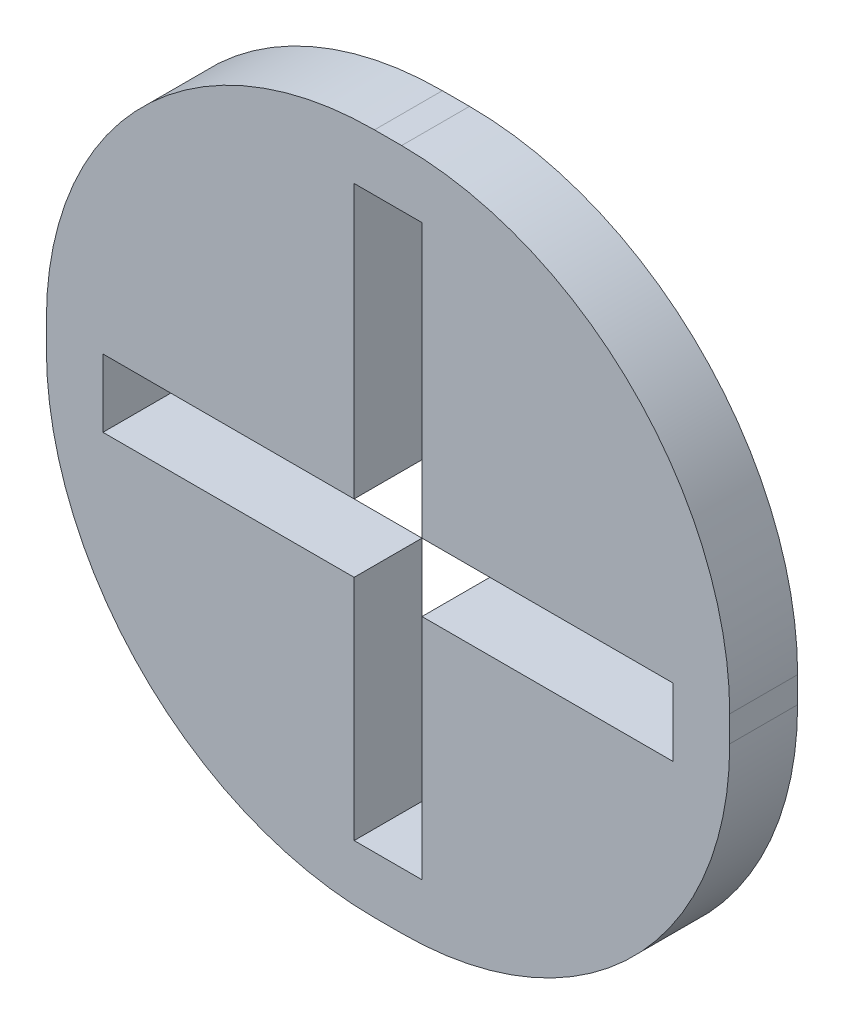
ISO-10303-21;
HEADER;
FILE_DESCRIPTION(('STEP AP214'),'2;1');
FILE_NAME('part.step','',(''),(''),'','','');
FILE_SCHEMA(('AUTOMOTIVE_DESIGN { 1 0 10303 214 1 1 1 1 }'));
ENDSEC;
DATA;
#1=APPLICATION_CONTEXT('core data for automotive mechanical design processes');
#2=APPLICATION_PROTOCOL_DEFINITION('international standard','automotive_design',2000,#1);
#3=PRODUCT_CONTEXT('',#1,'mechanical');
#4=PRODUCT('Part','Part','',(#3));
#5=PRODUCT_RELATED_PRODUCT_CATEGORY('part','',(#4));
#6=PRODUCT_DEFINITION_FORMATION('','',#4);
#7=PRODUCT_DEFINITION_CONTEXT('part definition',#1,'design');
#8=PRODUCT_DEFINITION('design','',#6,#7);
#9=PRODUCT_DEFINITION_SHAPE('','',#8);
#10=(LENGTH_UNIT() NAMED_UNIT(*) SI_UNIT(.MILLI.,.METRE.));
#11=(NAMED_UNIT(*) PLANE_ANGLE_UNIT() SI_UNIT($,.RADIAN.));
#12=(NAMED_UNIT(*) SI_UNIT($,.STERADIAN.) SOLID_ANGLE_UNIT());
#13=UNCERTAINTY_MEASURE_WITH_UNIT(LENGTH_MEASURE(1.E-05),#10,'distance_accuracy_value','');
#14=(GEOMETRIC_REPRESENTATION_CONTEXT(3) GLOBAL_UNCERTAINTY_ASSIGNED_CONTEXT((#13)) GLOBAL_UNIT_ASSIGNED_CONTEXT((#10,
#11,#12)) REPRESENTATION_CONTEXT('',''));
#15=CARTESIAN_POINT('',(0.,0.,0.));
#16=DIRECTION('',(0.,0.,1.));
#17=DIRECTION('',(1.,0.,0.));
#18=AXIS2_PLACEMENT_3D('',#15,#16,#17);
#19=CARTESIAN_POINT('',(0.,15.075,3.));
#20=DIRECTION('',(0.,-1.,0.));
#21=DIRECTION('',(0.,0.,-1.));
#22=AXIS2_PLACEMENT_3D('',#19,#20,#21);
#23=PLANE('',#22);
#24=DIRECTION('',(-1.,0.,0.));
#25=VECTOR('',#24,1.);
#26=CARTESIAN_POINT('',(0.,15.075,0.));
#27=LINE('',#26,#25);
#28=CARTESIAN_POINT('',(0.599999999999993,15.075,0.));
#29=VERTEX_POINT('',#28);
#30=CARTESIAN_POINT('',(-0.600000000000011,15.075,0.));
#31=VERTEX_POINT('',#30);
#32=EDGE_CURVE('E254',#29,#31,#27,.T.);
#33=ORIENTED_EDGE('',*,*,#32,.T.);
#34=DIRECTION('',(0.,0.,-1.));
#35=VECTOR('',#34,1.);
#36=CARTESIAN_POINT('',(-0.600000000000011,15.075,3.));
#37=LINE('',#36,#35);
#38=CARTESIAN_POINT('',(-0.600000000000011,15.075,3.));
#39=VERTEX_POINT('',#38);
#40=EDGE_CURVE('E11',#39,#31,#37,.T.);
#41=ORIENTED_EDGE('',*,*,#40,.F.);
#42=DIRECTION('',(-1.,0.,0.));
#43=VECTOR('',#42,1.);
#44=CARTESIAN_POINT('',(0.,15.075,3.));
#45=LINE('',#44,#43);
#46=CARTESIAN_POINT('',(0.599999999999993,15.075,3.));
#47=VERTEX_POINT('',#46);
#48=EDGE_CURVE('E405',#47,#39,#45,.T.);
#49=ORIENTED_EDGE('',*,*,#48,.F.);
#50=DIRECTION('',(0.,0.,-1.));
#51=VECTOR('',#50,1.);
#52=CARTESIAN_POINT('',(0.599999999999993,15.075,3.));
#53=LINE('',#52,#51);
#54=EDGE_CURVE('E281',#47,#29,#53,.T.);
#55=ORIENTED_EDGE('',*,*,#54,.T.);
#56=EDGE_LOOP('',(#33,#41,#49,#55));
#57=FACE_BOUND('',#56,.T.);
#58=ADVANCED_FACE('F45',(#57),#23,.F.);
#59=CARTESIAN_POINT('',(-0.600000000000009,0.575000000000023,3.));
#60=DIRECTION('',(0.,0.,-1.));
#61=DIRECTION('',(-1.,0.,0.));
#62=AXIS2_PLACEMENT_3D('',#59,#60,#61);
#63=CYLINDRICAL_SURFACE('',#62,14.5);
#64=CARTESIAN_POINT('',(-0.600000000000009,0.575000000000023,0.));
#65=DIRECTION('',(0.,0.,1.));
#66=DIRECTION('',(1.,0.,0.));
#67=AXIS2_PLACEMENT_3D('',#64,#65,#66);
#68=CIRCLE('',#67,14.5);
#69=CARTESIAN_POINT('',(-15.1,0.575000000000014,0.));
#70=VERTEX_POINT('',#69);
#71=EDGE_CURVE('E258',#31,#70,#68,.T.);
#72=ORIENTED_EDGE('',*,*,#71,.T.);
#73=DIRECTION('',(0.,0.,-1.));
#74=VECTOR('',#73,1.);
#75=CARTESIAN_POINT('',(-15.1,0.575000000000014,3.));
#76=LINE('',#75,#74);
#77=CARTESIAN_POINT('',(-15.1,0.575000000000014,3.));
#78=VERTEX_POINT('',#77);
#79=EDGE_CURVE('E56',#78,#70,#76,.T.);
#80=ORIENTED_EDGE('',*,*,#79,.F.);
#81=CARTESIAN_POINT('',(-0.600000000000009,0.575000000000023,3.));
#82=DIRECTION('',(0.,0.,1.));
#83=DIRECTION('',(1.,0.,0.));
#84=AXIS2_PLACEMENT_3D('',#81,#82,#83);
#85=CIRCLE('',#84,14.5);
#86=EDGE_CURVE('E408',#39,#78,#85,.T.);
#87=ORIENTED_EDGE('',*,*,#86,.F.);
#88=ORIENTED_EDGE('',*,*,#40,.T.);
#89=EDGE_LOOP('',(#72,#80,#87,#88));
#90=FACE_BOUND('',#89,.T.);
#91=ADVANCED_FACE('F440',(#90),#63,.T.);
#92=CARTESIAN_POINT('',(-15.1,0.,3.));
#93=DIRECTION('',(-1.,0.,0.));
#94=DIRECTION('',(0.,0.,1.));
#95=AXIS2_PLACEMENT_3D('',#92,#93,#94);
#96=PLANE('',#95);
#97=DIRECTION('',(0.,1.,0.));
#98=VECTOR('',#97,1.);
#99=CARTESIAN_POINT('',(-15.1,0.,0.));
#100=LINE('',#99,#98);
#101=CARTESIAN_POINT('',(-15.1,-0.575000000000006,0.));
#102=VERTEX_POINT('',#101);
#103=EDGE_CURVE('E262',#102,#70,#100,.T.);
#104=ORIENTED_EDGE('',*,*,#103,.F.);
#105=DIRECTION('',(0.,0.,-1.));
#106=VECTOR('',#105,1.);
#107=CARTESIAN_POINT('',(-15.1,-0.575000000000006,3.));
#108=LINE('',#107,#106);
#109=CARTESIAN_POINT('',(-15.1,-0.575000000000006,3.));
#110=VERTEX_POINT('',#109);
#111=EDGE_CURVE('E291',#110,#102,#108,.T.);
#112=ORIENTED_EDGE('',*,*,#111,.F.);
#113=DIRECTION('',(0.,1.,0.));
#114=VECTOR('',#113,1.);
#115=CARTESIAN_POINT('',(-15.1,0.,3.));
#116=LINE('',#115,#114);
#117=EDGE_CURVE('E411',#110,#78,#116,.T.);
#118=ORIENTED_EDGE('',*,*,#117,.T.);
#119=ORIENTED_EDGE('',*,*,#79,.T.);
#120=EDGE_LOOP('',(#104,#112,#118,#119));
#121=FACE_BOUND('',#120,.T.);
#122=ADVANCED_FACE('F445',(#121),#96,.T.);
#123=CARTESIAN_POINT('',(-0.600000000000009,-0.574999999999998,3.));
#124=DIRECTION('',(0.,0.,-1.));
#125=DIRECTION('',(-1.,0.,0.));
#126=AXIS2_PLACEMENT_3D('',#123,#124,#125);
#127=CYLINDRICAL_SURFACE('',#126,14.5);
#128=CARTESIAN_POINT('',(-0.600000000000009,-0.574999999999998,0.));
#129=DIRECTION('',(0.,0.,1.));
#130=DIRECTION('',(1.,0.,0.));
#131=AXIS2_PLACEMENT_3D('',#128,#129,#130);
#132=CIRCLE('',#131,14.5);
#133=CARTESIAN_POINT('',(-0.600000000000007,-15.075,0.));
#134=VERTEX_POINT('',#133);
#135=EDGE_CURVE('E266',#134,#102,#132,.F.);
#136=ORIENTED_EDGE('',*,*,#135,.F.);
#137=DIRECTION('',(0.,0.,-1.));
#138=VECTOR('',#137,1.);
#139=CARTESIAN_POINT('',(-0.600000000000007,-15.075,3.));
#140=LINE('',#139,#138);
#141=CARTESIAN_POINT('',(-0.600000000000007,-15.075,3.));
#142=VERTEX_POINT('',#141);
#143=EDGE_CURVE('E288',#142,#134,#140,.T.);
#144=ORIENTED_EDGE('',*,*,#143,.F.);
#145=CARTESIAN_POINT('',(-0.600000000000009,-0.574999999999998,3.));
#146=DIRECTION('',(0.,0.,1.));
#147=DIRECTION('',(1.,0.,0.));
#148=AXIS2_PLACEMENT_3D('',#145,#146,#147);
#149=CIRCLE('',#148,14.5);
#150=EDGE_CURVE('E415',#142,#110,#149,.F.);
#151=ORIENTED_EDGE('',*,*,#150,.T.);
#152=ORIENTED_EDGE('',*,*,#111,.T.);
#153=EDGE_LOOP('',(#136,#144,#151,#152));
#154=FACE_BOUND('',#153,.T.);
#155=ADVANCED_FACE('F608',(#154),#127,.T.);
#156=CARTESIAN_POINT('',(0.,-15.075,3.));
#157=DIRECTION('',(0.,-1.,0.));
#158=DIRECTION('',(0.,0.,-1.));
#159=AXIS2_PLACEMENT_3D('',#156,#157,#158);
#160=PLANE('',#159);
#161=DIRECTION('',(-1.,0.,0.));
#162=VECTOR('',#161,1.);
#163=CARTESIAN_POINT('',(0.,-15.075,0.));
#164=LINE('',#163,#162);
#165=CARTESIAN_POINT('',(0.600000000000007,-15.075,0.));
#166=VERTEX_POINT('',#165);
#167=EDGE_CURVE('E270',#166,#134,#164,.T.);
#168=ORIENTED_EDGE('',*,*,#167,.F.);
#169=DIRECTION('',(0.,0.,-1.));
#170=VECTOR('',#169,1.);
#171=CARTESIAN_POINT('',(0.600000000000007,-15.075,3.));
#172=LINE('',#171,#170);
#173=CARTESIAN_POINT('',(0.600000000000007,-15.075,3.));
#174=VERTEX_POINT('',#173);
#175=EDGE_CURVE('E212',#174,#166,#172,.T.);
#176=ORIENTED_EDGE('',*,*,#175,.F.);
#177=DIRECTION('',(-1.,0.,0.));
#178=VECTOR('',#177,1.);
#179=CARTESIAN_POINT('',(0.,-15.075,3.));
#180=LINE('',#179,#178);
#181=EDGE_CURVE('E203',#174,#142,#180,.T.);
#182=ORIENTED_EDGE('',*,*,#181,.T.);
#183=ORIENTED_EDGE('',*,*,#143,.T.);
#184=EDGE_LOOP('',(#168,#176,#182,#183));
#185=FACE_BOUND('',#184,.T.);
#186=ADVANCED_FACE('F421',(#185),#160,.T.);
#187=CARTESIAN_POINT('',(0.6,-0.574999999999997,3.));
#188=DIRECTION('',(0.,0.,-1.));
#189=DIRECTION('',(-1.,0.,0.));
#190=AXIS2_PLACEMENT_3D('',#187,#188,#189);
#191=CYLINDRICAL_SURFACE('',#190,14.5);
#192=CARTESIAN_POINT('',(0.6,-0.574999999999997,0.));
#193=DIRECTION('',(0.,0.,1.));
#194=DIRECTION('',(1.,0.,0.));
#195=AXIS2_PLACEMENT_3D('',#192,#193,#194);
#196=CIRCLE('',#195,14.5);
#197=CARTESIAN_POINT('',(15.1,-0.574999999999997,0.));
#198=VERTEX_POINT('',#197);
#199=EDGE_CURVE('E210',#166,#198,#196,.T.);
#200=ORIENTED_EDGE('',*,*,#199,.T.);
#201=DIRECTION('',(0.,0.,-1.));
#202=VECTOR('',#201,1.);
#203=CARTESIAN_POINT('',(15.1,-0.574999999999997,3.));
#204=LINE('',#203,#202);
#205=CARTESIAN_POINT('',(15.1,-0.574999999999997,3.));
#206=VERTEX_POINT('',#205);
#207=EDGE_CURVE('E207',#206,#198,#204,.T.);
#208=ORIENTED_EDGE('',*,*,#207,.F.);
#209=CARTESIAN_POINT('',(0.6,-0.574999999999997,3.));
#210=DIRECTION('',(0.,0.,1.));
#211=DIRECTION('',(1.,0.,0.));
#212=AXIS2_PLACEMENT_3D('',#209,#210,#211);
#213=CIRCLE('',#212,14.5);
#214=EDGE_CURVE('E196',#174,#206,#213,.T.);
#215=ORIENTED_EDGE('',*,*,#214,.F.);
#216=ORIENTED_EDGE('',*,*,#175,.T.);
#217=EDGE_LOOP('',(#200,#208,#215,#216));
#218=FACE_BOUND('',#217,.T.);
#219=ADVANCED_FACE('F208',(#218),#191,.T.);
#220=CARTESIAN_POINT('',(15.1,0.,3.));
#221=DIRECTION('',(-1.,0.,0.));
#222=DIRECTION('',(0.,0.,1.));
#223=AXIS2_PLACEMENT_3D('',#220,#221,#222);
#224=PLANE('',#223);
#225=DIRECTION('',(0.,1.,0.));
#226=VECTOR('',#225,1.);
#227=CARTESIAN_POINT('',(15.1,0.,0.));
#228=LINE('',#227,#226);
#229=CARTESIAN_POINT('',(15.1,0.575000000000023,0.));
#230=VERTEX_POINT('',#229);
#231=EDGE_CURVE('E130',#198,#230,#228,.T.);
#232=ORIENTED_EDGE('',*,*,#231,.T.);
#233=DIRECTION('',(0.,0.,-1.));
#234=VECTOR('',#233,1.);
#235=CARTESIAN_POINT('',(15.1,0.575000000000023,3.));
#236=LINE('',#235,#234);
#237=CARTESIAN_POINT('',(15.1,0.575000000000023,3.));
#238=VERTEX_POINT('',#237);
#239=EDGE_CURVE('E213',#238,#230,#236,.T.);
#240=ORIENTED_EDGE('',*,*,#239,.F.);
#241=DIRECTION('',(0.,1.,0.));
#242=VECTOR('',#241,1.);
#243=CARTESIAN_POINT('',(15.1,0.,3.));
#244=LINE('',#243,#242);
#245=EDGE_CURVE('E200',#206,#238,#244,.T.);
#246=ORIENTED_EDGE('',*,*,#245,.F.);
#247=ORIENTED_EDGE('',*,*,#207,.T.);
#248=EDGE_LOOP('',(#232,#240,#246,#247));
#249=FACE_BOUND('',#248,.T.);
#250=ADVANCED_FACE('F215',(#249),#224,.F.);
#251=CARTESIAN_POINT('',(0.,12.575,3.));
#252=DIRECTION('',(0.,1.,0.));
#253=DIRECTION('',(0.,0.,1.));
#254=AXIS2_PLACEMENT_3D('',#251,#252,#253);
#255=PLANE('',#254);
#256=DIRECTION('',(1.,0.,0.));
#257=VECTOR('',#256,1.);
#258=CARTESIAN_POINT('',(0.,12.575,0.));
#259=LINE('',#258,#257);
#260=CARTESIAN_POINT('',(-1.5,12.575,0.));
#261=VERTEX_POINT('',#260);
#262=CARTESIAN_POINT('',(1.5,12.575,0.));
#263=VERTEX_POINT('',#262);
#264=EDGE_CURVE('E223',#261,#263,#259,.T.);
#265=ORIENTED_EDGE('',*,*,#264,.T.);
#266=DIRECTION('',(0.,0.,-1.));
#267=VECTOR('',#266,1.);
#268=CARTESIAN_POINT('',(1.5,12.575,3.));
#269=LINE('',#268,#267);
#270=CARTESIAN_POINT('',(1.5,12.575,3.));
#271=VERTEX_POINT('',#270);
#272=EDGE_CURVE('E49',#271,#263,#269,.T.);
#273=ORIENTED_EDGE('',*,*,#272,.F.);
#274=DIRECTION('',(1.,0.,0.));
#275=VECTOR('',#274,1.);
#276=CARTESIAN_POINT('',(0.,12.575,3.));
#277=LINE('',#276,#275);
#278=CARTESIAN_POINT('',(-1.5,12.575,3.));
#279=VERTEX_POINT('',#278);
#280=EDGE_CURVE('E280',#279,#271,#277,.T.);
#281=ORIENTED_EDGE('',*,*,#280,.F.);
#282=DIRECTION('',(0.,0.,-1.));
#283=VECTOR('',#282,1.);
#284=CARTESIAN_POINT('',(-1.5,12.575,3.));
#285=LINE('',#284,#283);
#286=EDGE_CURVE('E219',#279,#261,#285,.T.);
#287=ORIENTED_EDGE('',*,*,#286,.T.);
#288=EDGE_LOOP('',(#265,#273,#281,#287));
#289=FACE_BOUND('',#288,.T.);
#290=ADVANCED_FACE('F47',(#289),#255,.F.);
#291=CARTESIAN_POINT('',(1.5,0.,3.));
#292=DIRECTION('',(1.,0.,0.));
#293=DIRECTION('',(0.,0.,-1.));
#294=AXIS2_PLACEMENT_3D('',#291,#292,#293);
#295=PLANE('',#294);
#296=DIRECTION('',(0.,-1.,0.));
#297=VECTOR('',#296,1.);
#298=CARTESIAN_POINT('',(1.5,0.,0.));
#299=LINE('',#298,#297);
#300=CARTESIAN_POINT('',(1.5,0.499999999999999,0.));
#301=VERTEX_POINT('',#300);
#302=EDGE_CURVE('E227',#263,#301,#299,.T.);
#303=ORIENTED_EDGE('',*,*,#302,.T.);
#304=DIRECTION('',(0.,0.,-1.));
#305=VECTOR('',#304,1.);
#306=CARTESIAN_POINT('',(1.5,0.499999999999999,3.));
#307=LINE('',#306,#305);
#308=CARTESIAN_POINT('',(1.5,0.499999999999999,3.));
#309=VERTEX_POINT('',#308);
#310=EDGE_CURVE('E329',#309,#301,#307,.T.);
#311=ORIENTED_EDGE('',*,*,#310,.F.);
#312=DIRECTION('',(0.,-1.,0.));
#313=VECTOR('',#312,1.);
#314=CARTESIAN_POINT('',(1.5,0.,3.));
#315=LINE('',#314,#313);
#316=EDGE_CURVE('E145',#271,#309,#315,.T.);
#317=ORIENTED_EDGE('',*,*,#316,.F.);
#318=ORIENTED_EDGE('',*,*,#272,.T.);
#319=EDGE_LOOP('',(#303,#311,#317,#318));
#320=FACE_BOUND('',#319,.T.);
#321=ADVANCED_FACE('F337',(#320),#295,.F.);
#322=CARTESIAN_POINT('',(0.,0.499999999999999,3.));
#323=DIRECTION('',(0.,1.,0.));
#324=DIRECTION('',(0.,0.,1.));
#325=AXIS2_PLACEMENT_3D('',#322,#323,#324);
#326=PLANE('',#325);
#327=DIRECTION('',(1.,0.,0.));
#328=VECTOR('',#327,1.);
#329=CARTESIAN_POINT('',(0.,0.499999999999999,0.));
#330=LINE('',#329,#328);
#331=CARTESIAN_POINT('',(12.6,0.499999999999999,0.));
#332=VERTEX_POINT('',#331);
#333=EDGE_CURVE('E230',#301,#332,#330,.T.);
#334=ORIENTED_EDGE('',*,*,#333,.T.);
#335=DIRECTION('',(0.,0.,-1.));
#336=VECTOR('',#335,1.);
#337=CARTESIAN_POINT('',(12.6,0.499999999999999,3.));
#338=LINE('',#337,#336);
#339=CARTESIAN_POINT('',(12.6,0.499999999999999,3.));
#340=VERTEX_POINT('',#339);
#341=EDGE_CURVE('E326',#340,#332,#338,.T.);
#342=ORIENTED_EDGE('',*,*,#341,.F.);
#343=DIRECTION('',(1.,0.,0.));
#344=VECTOR('',#343,1.);
#345=CARTESIAN_POINT('',(0.,0.499999999999999,3.));
#346=LINE('',#345,#344);
#347=EDGE_CURVE('E477',#309,#340,#346,.T.);
#348=ORIENTED_EDGE('',*,*,#347,.F.);
#349=ORIENTED_EDGE('',*,*,#310,.T.);
#350=EDGE_LOOP('',(#334,#342,#348,#349));
#351=FACE_BOUND('',#350,.T.);
#352=ADVANCED_FACE('F452',(#351),#326,.F.);
#353=CARTESIAN_POINT('',(12.6,0.,3.));
#354=DIRECTION('',(1.,0.,0.));
#355=DIRECTION('',(0.,0.,-1.));
#356=AXIS2_PLACEMENT_3D('',#353,#354,#355);
#357=PLANE('',#356);
#358=DIRECTION('',(0.,-1.,0.));
#359=VECTOR('',#358,1.);
#360=CARTESIAN_POINT('',(12.6,0.,0.));
#361=LINE('',#360,#359);
#362=CARTESIAN_POINT('',(12.6,-2.5,0.));
#363=VERTEX_POINT('',#362);
#364=EDGE_CURVE('E234',#332,#363,#361,.T.);
#365=ORIENTED_EDGE('',*,*,#364,.T.);
#366=DIRECTION('',(0.,0.,-1.));
#367=VECTOR('',#366,1.);
#368=CARTESIAN_POINT('',(12.6,-2.5,3.));
#369=LINE('',#368,#367);
#370=CARTESIAN_POINT('',(12.6,-2.5,3.));
#371=VERTEX_POINT('',#370);
#372=EDGE_CURVE('E322',#371,#363,#369,.T.);
#373=ORIENTED_EDGE('',*,*,#372,.F.);
#374=DIRECTION('',(0.,-1.,0.));
#375=VECTOR('',#374,1.);
#376=CARTESIAN_POINT('',(12.6,0.,3.));
#377=LINE('',#376,#375);
#378=EDGE_CURVE('E475',#340,#371,#377,.T.);
#379=ORIENTED_EDGE('',*,*,#378,.F.);
#380=ORIENTED_EDGE('',*,*,#341,.T.);
#381=EDGE_LOOP('',(#365,#373,#379,#380));
#382=FACE_BOUND('',#381,.T.);
#383=ADVANCED_FACE('F461',(#382),#357,.F.);
#384=CARTESIAN_POINT('',(0.,-2.5,3.));
#385=DIRECTION('',(0.,-1.,0.));
#386=DIRECTION('',(0.,0.,-1.));
#387=AXIS2_PLACEMENT_3D('',#384,#385,#386);
#388=PLANE('',#387);
#389=DIRECTION('',(-1.,0.,0.));
#390=VECTOR('',#389,1.);
#391=CARTESIAN_POINT('',(0.,-2.5,0.));
#392=LINE('',#391,#390);
#393=CARTESIAN_POINT('',(1.5,-2.5,0.));
#394=VERTEX_POINT('',#393);
#395=EDGE_CURVE('E238',#363,#394,#392,.T.);
#396=ORIENTED_EDGE('',*,*,#395,.T.);
#397=DIRECTION('',(0.,0.,-1.));
#398=VECTOR('',#397,1.);
#399=CARTESIAN_POINT('',(1.5,-2.5,3.));
#400=LINE('',#399,#398);
#401=CARTESIAN_POINT('',(1.5,-2.5,3.));
#402=VERTEX_POINT('',#401);
#403=EDGE_CURVE('E318',#402,#394,#400,.T.);
#404=ORIENTED_EDGE('',*,*,#403,.F.);
#405=DIRECTION('',(-1.,0.,0.));
#406=VECTOR('',#405,1.);
#407=CARTESIAN_POINT('',(0.,-2.5,3.));
#408=LINE('',#407,#406);
#409=EDGE_CURVE('E397',#371,#402,#408,.T.);
#410=ORIENTED_EDGE('',*,*,#409,.F.);
#411=ORIENTED_EDGE('',*,*,#372,.T.);
#412=EDGE_LOOP('',(#396,#404,#410,#411));
#413=FACE_BOUND('',#412,.T.);
#414=ADVANCED_FACE('F457',(#413),#388,.F.);
#415=CARTESIAN_POINT('',(1.5,-12.575,0.));
#416=VERTEX_POINT('',#415);
#417=EDGE_CURVE('E231',#394,#416,#299,.T.);
#418=ORIENTED_EDGE('',*,*,#417,.T.);
#419=DIRECTION('',(0.,0.,-1.));
#420=VECTOR('',#419,1.);
#421=CARTESIAN_POINT('',(1.5,-12.575,3.));
#422=LINE('',#421,#420);
#423=CARTESIAN_POINT('',(1.5,-12.575,3.));
#424=VERTEX_POINT('',#423);
#425=EDGE_CURVE('E315',#424,#416,#422,.T.);
#426=ORIENTED_EDGE('',*,*,#425,.F.);
#427=EDGE_CURVE('E391',#402,#424,#315,.T.);
#428=ORIENTED_EDGE('',*,*,#427,.F.);
#429=ORIENTED_EDGE('',*,*,#403,.T.);
#430=EDGE_LOOP('',(#418,#426,#428,#429));
#431=FACE_BOUND('',#430,.T.);
#432=ADVANCED_FACE('F377',(#431),#295,.F.);
#433=CARTESIAN_POINT('',(0.,-12.575,3.));
#434=DIRECTION('',(0.,1.,0.));
#435=DIRECTION('',(0.,0.,1.));
#436=AXIS2_PLACEMENT_3D('',#433,#434,#435);
#437=PLANE('',#436);
#438=DIRECTION('',(1.,0.,0.));
#439=VECTOR('',#438,1.);
#440=CARTESIAN_POINT('',(0.,-12.575,0.));
#441=LINE('',#440,#439);
#442=CARTESIAN_POINT('',(-1.5,-12.575,0.));
#443=VERTEX_POINT('',#442);
#444=EDGE_CURVE('E242',#443,#416,#441,.T.);
#445=ORIENTED_EDGE('',*,*,#444,.F.);
#446=DIRECTION('',(0.,0.,-1.));
#447=VECTOR('',#446,1.);
#448=CARTESIAN_POINT('',(-1.5,-12.575,3.));
#449=LINE('',#448,#447);
#450=CARTESIAN_POINT('',(-1.5,-12.575,3.));
#451=VERTEX_POINT('',#450);
#452=EDGE_CURVE('E312',#451,#443,#449,.T.);
#453=ORIENTED_EDGE('',*,*,#452,.F.);
#454=DIRECTION('',(1.,0.,0.));
#455=VECTOR('',#454,1.);
#456=CARTESIAN_POINT('',(0.,-12.575,3.));
#457=LINE('',#456,#455);
#458=EDGE_CURVE('E386',#451,#424,#457,.T.);
#459=ORIENTED_EDGE('',*,*,#458,.T.);
#460=ORIENTED_EDGE('',*,*,#425,.T.);
#461=EDGE_LOOP('',(#445,#453,#459,#460));
#462=FACE_BOUND('',#461,.T.);
#463=ADVANCED_FACE('F384',(#462),#437,.T.);
#464=CARTESIAN_POINT('',(-1.5,0.,3.));
#465=DIRECTION('',(1.,0.,0.));
#466=DIRECTION('',(0.,0.,-1.));
#467=AXIS2_PLACEMENT_3D('',#464,#465,#466);
#468=PLANE('',#467);
#469=DIRECTION('',(0.,-1.,0.));
#470=VECTOR('',#469,1.);
#471=CARTESIAN_POINT('',(-1.5,0.,0.));
#472=LINE('',#471,#470);
#473=CARTESIAN_POINT('',(-1.5,-2.5,0.));
#474=VERTEX_POINT('',#473);
#475=EDGE_CURVE('E246',#474,#443,#472,.T.);
#476=ORIENTED_EDGE('',*,*,#475,.F.);
#477=DIRECTION('',(0.,0.,-1.));
#478=VECTOR('',#477,1.);
#479=CARTESIAN_POINT('',(-1.5,-2.5,3.));
#480=LINE('',#479,#478);
#481=CARTESIAN_POINT('',(-1.5,-2.5,3.));
#482=VERTEX_POINT('',#481);
#483=EDGE_CURVE('E309',#482,#474,#480,.T.);
#484=ORIENTED_EDGE('',*,*,#483,.F.);
#485=DIRECTION('',(0.,-1.,0.));
#486=VECTOR('',#485,1.);
#487=CARTESIAN_POINT('',(-1.5,0.,3.));
#488=LINE('',#487,#486);
#489=EDGE_CURVE('E390',#482,#451,#488,.T.);
#490=ORIENTED_EDGE('',*,*,#489,.T.);
#491=ORIENTED_EDGE('',*,*,#452,.T.);
#492=EDGE_LOOP('',(#476,#484,#490,#491));
#493=FACE_BOUND('',#492,.T.);
#494=ADVANCED_FACE('F436',(#493),#468,.T.);
#495=CARTESIAN_POINT('',(-12.6,-2.5,0.));
#496=VERTEX_POINT('',#495);
#497=EDGE_CURVE('E241',#474,#496,#392,.T.);
#498=ORIENTED_EDGE('',*,*,#497,.T.);
#499=DIRECTION('',(0.,0.,-1.));
#500=VECTOR('',#499,1.);
#501=CARTESIAN_POINT('',(-12.6,-2.5,3.));
#502=LINE('',#501,#500);
#503=CARTESIAN_POINT('',(-12.6,-2.5,3.));
#504=VERTEX_POINT('',#503);
#505=EDGE_CURVE('E305',#504,#496,#502,.T.);
#506=ORIENTED_EDGE('',*,*,#505,.F.);
#507=EDGE_CURVE('E369',#482,#504,#408,.T.);
#508=ORIENTED_EDGE('',*,*,#507,.F.);
#509=ORIENTED_EDGE('',*,*,#483,.T.);
#510=EDGE_LOOP('',(#498,#506,#508,#509));
#511=FACE_BOUND('',#510,.T.);
#512=ADVANCED_FACE('F368',(#511),#388,.F.);
#513=CARTESIAN_POINT('',(-12.6,0.,3.));
#514=DIRECTION('',(-1.,0.,0.));
#515=DIRECTION('',(0.,0.,1.));
#516=AXIS2_PLACEMENT_3D('',#513,#514,#515);
#517=PLANE('',#516);
#518=DIRECTION('',(0.,1.,0.));
#519=VECTOR('',#518,1.);
#520=CARTESIAN_POINT('',(-12.6,0.,0.));
#521=LINE('',#520,#519);
#522=CARTESIAN_POINT('',(-12.6,0.499999999999999,0.));
#523=VERTEX_POINT('',#522);
#524=EDGE_CURVE('E251',#496,#523,#521,.T.);
#525=ORIENTED_EDGE('',*,*,#524,.T.);
#526=DIRECTION('',(0.,0.,-1.));
#527=VECTOR('',#526,1.);
#528=CARTESIAN_POINT('',(-12.6,0.499999999999999,3.));
#529=LINE('',#528,#527);
#530=CARTESIAN_POINT('',(-12.6,0.499999999999999,3.));
#531=VERTEX_POINT('',#530);
#532=EDGE_CURVE('E301',#531,#523,#529,.T.);
#533=ORIENTED_EDGE('',*,*,#532,.F.);
#534=DIRECTION('',(0.,1.,0.));
#535=VECTOR('',#534,1.);
#536=CARTESIAN_POINT('',(-12.6,0.,3.));
#537=LINE('',#536,#535);
#538=EDGE_CURVE('E365',#504,#531,#537,.T.);
#539=ORIENTED_EDGE('',*,*,#538,.F.);
#540=ORIENTED_EDGE('',*,*,#505,.T.);
#541=EDGE_LOOP('',(#525,#533,#539,#540));
#542=FACE_BOUND('',#541,.T.);
#543=ADVANCED_FACE('F362',(#542),#517,.F.);
#544=CARTESIAN_POINT('',(-1.5,0.499999999999999,0.));
#545=VERTEX_POINT('',#544);
#546=EDGE_CURVE('E235',#523,#545,#330,.T.);
#547=ORIENTED_EDGE('',*,*,#546,.T.);
#548=DIRECTION('',(0.,0.,-1.));
#549=VECTOR('',#548,1.);
#550=CARTESIAN_POINT('',(-1.5,0.499999999999999,3.));
#551=LINE('',#550,#549);
#552=CARTESIAN_POINT('',(-1.5,0.499999999999999,3.));
#553=VERTEX_POINT('',#552);
#554=EDGE_CURVE('E298',#553,#545,#551,.T.);
#555=ORIENTED_EDGE('',*,*,#554,.F.);
#556=EDGE_CURVE('E404',#531,#553,#346,.T.);
#557=ORIENTED_EDGE('',*,*,#556,.F.);
#558=ORIENTED_EDGE('',*,*,#532,.T.);
#559=EDGE_LOOP('',(#547,#555,#557,#558));
#560=FACE_BOUND('',#559,.T.);
#561=ADVANCED_FACE('F355',(#560),#326,.F.);
#562=EDGE_CURVE('E250',#261,#545,#472,.T.);
#563=ORIENTED_EDGE('',*,*,#562,.F.);
#564=ORIENTED_EDGE('',*,*,#286,.F.);
#565=EDGE_CURVE('E396',#279,#553,#488,.T.);
#566=ORIENTED_EDGE('',*,*,#565,.T.);
#567=ORIENTED_EDGE('',*,*,#554,.T.);
#568=EDGE_LOOP('',(#563,#564,#566,#567));
#569=FACE_BOUND('',#568,.T.);
#570=ADVANCED_FACE('F348',(#569),#468,.T.);
#571=CARTESIAN_POINT('',(0.6,0.575000000000023,3.));
#572=DIRECTION('',(0.,0.,-1.));
#573=DIRECTION('',(-1.,0.,0.));
#574=AXIS2_PLACEMENT_3D('',#571,#572,#573);
#575=CYLINDRICAL_SURFACE('',#574,14.5);
#576=CARTESIAN_POINT('',(0.6,0.575000000000023,0.));
#577=DIRECTION('',(0.,0.,1.));
#578=DIRECTION('',(1.,0.,0.));
#579=AXIS2_PLACEMENT_3D('',#576,#577,#578);
#580=CIRCLE('',#579,14.5);
#581=EDGE_CURVE('E136',#230,#29,#580,.T.);
#582=ORIENTED_EDGE('',*,*,#581,.T.);
#583=ORIENTED_EDGE('',*,*,#54,.F.);
#584=CARTESIAN_POINT('',(0.6,0.575000000000023,3.));
#585=DIRECTION('',(0.,0.,1.));
#586=DIRECTION('',(1.,0.,0.));
#587=AXIS2_PLACEMENT_3D('',#584,#585,#586);
#588=CIRCLE('',#587,14.5);
#589=EDGE_CURVE('E65',#238,#47,#588,.T.);
#590=ORIENTED_EDGE('',*,*,#589,.F.);
#591=ORIENTED_EDGE('',*,*,#239,.T.);
#592=EDGE_LOOP('',(#582,#583,#590,#591));
#593=FACE_BOUND('',#592,.T.);
#594=ADVANCED_FACE('F427',(#593),#575,.T.);
#595=CARTESIAN_POINT('',(0.,0.,3.));
#596=DIRECTION('',(0.,0.,1.));
#597=DIRECTION('',(1.,0.,0.));
#598=AXIS2_PLACEMENT_3D('',#595,#596,#597);
#599=PLANE('',#598);
#600=ORIENTED_EDGE('',*,*,#280,.T.);
#601=ORIENTED_EDGE('',*,*,#316,.T.);
#602=ORIENTED_EDGE('',*,*,#347,.T.);
#603=ORIENTED_EDGE('',*,*,#378,.T.);
#604=ORIENTED_EDGE('',*,*,#409,.T.);
#605=ORIENTED_EDGE('',*,*,#427,.T.);
#606=ORIENTED_EDGE('',*,*,#458,.F.);
#607=ORIENTED_EDGE('',*,*,#489,.F.);
#608=ORIENTED_EDGE('',*,*,#507,.T.);
#609=ORIENTED_EDGE('',*,*,#538,.T.);
#610=ORIENTED_EDGE('',*,*,#556,.T.);
#611=ORIENTED_EDGE('',*,*,#565,.F.);
#612=EDGE_LOOP('',(#600,#601,#602,#603,#604,#605,#606,#607,#608,#609,#610,#611));
#613=FACE_BOUND('',#612,.T.);
#614=ORIENTED_EDGE('',*,*,#48,.T.);
#615=ORIENTED_EDGE('',*,*,#86,.T.);
#616=ORIENTED_EDGE('',*,*,#117,.F.);
#617=ORIENTED_EDGE('',*,*,#150,.F.);
#618=ORIENTED_EDGE('',*,*,#181,.F.);
#619=ORIENTED_EDGE('',*,*,#214,.T.);
#620=ORIENTED_EDGE('',*,*,#245,.T.);
#621=ORIENTED_EDGE('',*,*,#589,.T.);
#622=EDGE_LOOP('',(#614,#615,#616,#617,#618,#619,#620,#621));
#623=FACE_BOUND('',#622,.T.);
#624=ADVANCED_FACE('F198',(#613,#623),#599,.T.);
#625=CARTESIAN_POINT('',(0.,0.,0.));
#626=DIRECTION('',(0.,0.,1.));
#627=DIRECTION('',(1.,0.,0.));
#628=AXIS2_PLACEMENT_3D('',#625,#626,#627);
#629=PLANE('',#628);
#630=ORIENTED_EDGE('',*,*,#264,.F.);
#631=ORIENTED_EDGE('',*,*,#562,.T.);
#632=ORIENTED_EDGE('',*,*,#546,.F.);
#633=ORIENTED_EDGE('',*,*,#524,.F.);
#634=ORIENTED_EDGE('',*,*,#497,.F.);
#635=ORIENTED_EDGE('',*,*,#475,.T.);
#636=ORIENTED_EDGE('',*,*,#444,.T.);
#637=ORIENTED_EDGE('',*,*,#417,.F.);
#638=ORIENTED_EDGE('',*,*,#395,.F.);
#639=ORIENTED_EDGE('',*,*,#364,.F.);
#640=ORIENTED_EDGE('',*,*,#333,.F.);
#641=ORIENTED_EDGE('',*,*,#302,.F.);
#642=EDGE_LOOP('',(#630,#631,#632,#633,#634,#635,#636,#637,#638,#639,#640,#641));
#643=FACE_BOUND('',#642,.T.);
#644=ORIENTED_EDGE('',*,*,#32,.F.);
#645=ORIENTED_EDGE('',*,*,#581,.F.);
#646=ORIENTED_EDGE('',*,*,#231,.F.);
#647=ORIENTED_EDGE('',*,*,#199,.F.);
#648=ORIENTED_EDGE('',*,*,#167,.T.);
#649=ORIENTED_EDGE('',*,*,#135,.T.);
#650=ORIENTED_EDGE('',*,*,#103,.T.);
#651=ORIENTED_EDGE('',*,*,#71,.F.);
#652=EDGE_LOOP('',(#644,#645,#646,#647,#648,#649,#650,#651));
#653=FACE_BOUND('',#652,.T.);
#654=ADVANCED_FACE('F344',(#643,#653),#629,.F.);
#655=CLOSED_SHELL('',(#58,#91,#122,#155,#186,#219,#250,#290,#321,#352,#383,#414,#432,#463,#494,
#512,#543,#561,#570,#594,#624,#654));
#656=MANIFOLD_SOLID_BREP('B2',#655);
#657=ADVANCED_BREP_SHAPE_REPRESENTATION('',(#18,#656),#14);
#658=SHAPE_DEFINITION_REPRESENTATION(#9,#657);
ENDSEC;
END-ISO-10303-21;
